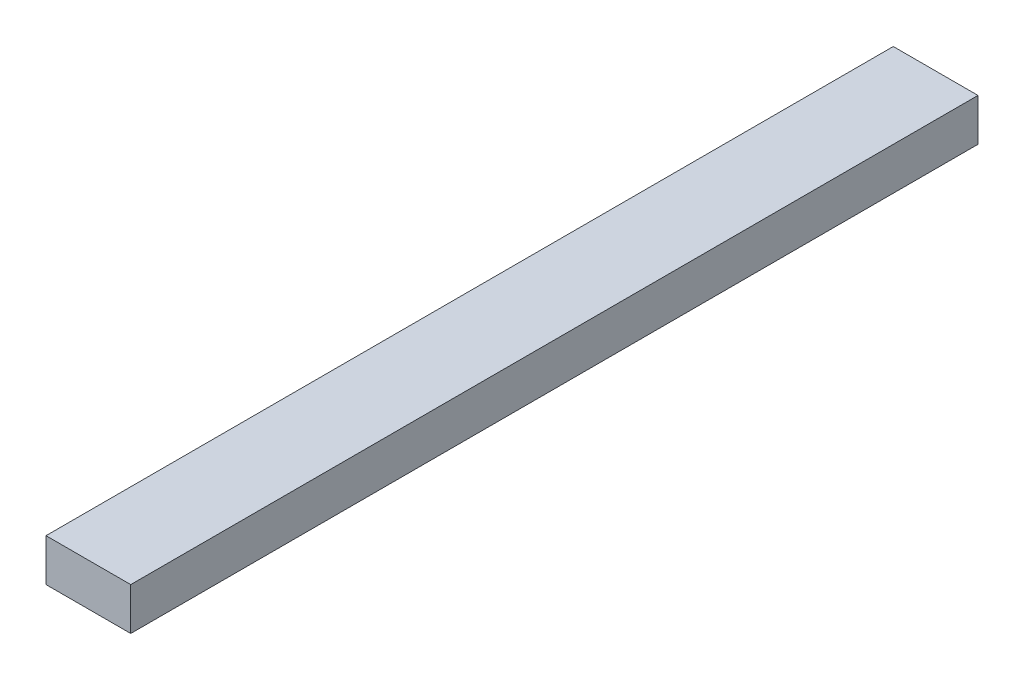
ISO-10303-21;
HEADER;
FILE_DESCRIPTION(('STEP AP214'),'2;1');
FILE_NAME('part.step','',(''),(''),'','','');
FILE_SCHEMA(('AUTOMOTIVE_DESIGN { 1 0 10303 214 1 1 1 1 }'));
ENDSEC;
DATA;
#1=APPLICATION_CONTEXT('core data for automotive mechanical design processes');
#2=APPLICATION_PROTOCOL_DEFINITION('international standard','automotive_design',2000,#1);
#3=PRODUCT_CONTEXT('',#1,'mechanical');
#4=PRODUCT('Part','Part','',(#3));
#5=PRODUCT_RELATED_PRODUCT_CATEGORY('part','',(#4));
#6=PRODUCT_DEFINITION_FORMATION('','',#4);
#7=PRODUCT_DEFINITION_CONTEXT('part definition',#1,'design');
#8=PRODUCT_DEFINITION('design','',#6,#7);
#9=PRODUCT_DEFINITION_SHAPE('','',#8);
#10=(LENGTH_UNIT() NAMED_UNIT(*) SI_UNIT(.MILLI.,.METRE.));
#11=(NAMED_UNIT(*) PLANE_ANGLE_UNIT() SI_UNIT($,.RADIAN.));
#12=(NAMED_UNIT(*) SI_UNIT($,.STERADIAN.) SOLID_ANGLE_UNIT());
#13=UNCERTAINTY_MEASURE_WITH_UNIT(LENGTH_MEASURE(1.E-05),#10,'distance_accuracy_value','');
#14=(GEOMETRIC_REPRESENTATION_CONTEXT(3) GLOBAL_UNCERTAINTY_ASSIGNED_CONTEXT((#13)) GLOBAL_UNIT_ASSIGNED_CONTEXT((#10,
#11,#12)) REPRESENTATION_CONTEXT('',''));
#15=CARTESIAN_POINT('',(0.,0.,0.));
#16=DIRECTION('',(0.,0.,1.));
#17=DIRECTION('',(1.,0.,0.));
#18=AXIS2_PLACEMENT_3D('',#15,#16,#17);
#19=CARTESIAN_POINT('',(0.,0.,1016.));
#20=DIRECTION('',(1.,0.,0.));
#21=DIRECTION('',(0.,0.,-1.));
#22=AXIS2_PLACEMENT_3D('',#19,#20,#21);
#23=PLANE('',#22);
#24=DIRECTION('',(0.,-1.,0.));
#25=VECTOR('',#24,1.);
#26=CARTESIAN_POINT('',(0.,0.,0.));
#27=LINE('',#26,#25);
#28=CARTESIAN_POINT('',(0.,50.8,0.));
#29=VERTEX_POINT('',#28);
#30=CARTESIAN_POINT('',(0.,0.,0.));
#31=VERTEX_POINT('',#30);
#32=EDGE_CURVE('E107',#29,#31,#27,.T.);
#33=ORIENTED_EDGE('',*,*,#32,.T.);
#34=DIRECTION('',(0.,0.,-1.));
#35=VECTOR('',#34,1.);
#36=CARTESIAN_POINT('',(0.,0.,1016.));
#37=LINE('',#36,#35);
#38=CARTESIAN_POINT('',(0.,0.,1016.));
#39=VERTEX_POINT('',#38);
#40=EDGE_CURVE('E11',#39,#31,#37,.T.);
#41=ORIENTED_EDGE('',*,*,#40,.F.);
#42=DIRECTION('',(0.,-1.,0.));
#43=VECTOR('',#42,1.);
#44=CARTESIAN_POINT('',(0.,0.,1016.));
#45=LINE('',#44,#43);
#46=CARTESIAN_POINT('',(0.,50.8,1016.));
#47=VERTEX_POINT('',#46);
#48=EDGE_CURVE('E91',#47,#39,#45,.T.);
#49=ORIENTED_EDGE('',*,*,#48,.F.);
#50=DIRECTION('',(0.,0.,-1.));
#51=VECTOR('',#50,1.);
#52=CARTESIAN_POINT('',(0.,50.8,1016.));
#53=LINE('',#52,#51);
#54=EDGE_CURVE('E103',#47,#29,#53,.T.);
#55=ORIENTED_EDGE('',*,*,#54,.T.);
#56=EDGE_LOOP('',(#33,#41,#49,#55));
#57=FACE_BOUND('',#56,.T.);
#58=ADVANCED_FACE('F39',(#57),#23,.F.);
#59=CARTESIAN_POINT('',(0.,0.,1016.));
#60=DIRECTION('',(0.,1.,0.));
#61=DIRECTION('',(0.,0.,1.));
#62=AXIS2_PLACEMENT_3D('',#59,#60,#61);
#63=PLANE('',#62);
#64=DIRECTION('',(1.,0.,0.));
#65=VECTOR('',#64,1.);
#66=CARTESIAN_POINT('',(0.,0.,0.));
#67=LINE('',#66,#65);
#68=CARTESIAN_POINT('',(101.6,0.,0.));
#69=VERTEX_POINT('',#68);
#70=EDGE_CURVE('E96',#31,#69,#67,.T.);
#71=ORIENTED_EDGE('',*,*,#70,.T.);
#72=DIRECTION('',(0.,0.,-1.));
#73=VECTOR('',#72,1.);
#74=CARTESIAN_POINT('',(101.6,0.,1016.));
#75=LINE('',#74,#73);
#76=CARTESIAN_POINT('',(101.6,0.,1016.));
#77=VERTEX_POINT('',#76);
#78=EDGE_CURVE('E48',#77,#69,#75,.T.);
#79=ORIENTED_EDGE('',*,*,#78,.F.);
#80=DIRECTION('',(1.,0.,0.));
#81=VECTOR('',#80,1.);
#82=CARTESIAN_POINT('',(0.,0.,1016.));
#83=LINE('',#82,#81);
#84=EDGE_CURVE('E86',#39,#77,#83,.T.);
#85=ORIENTED_EDGE('',*,*,#84,.F.);
#86=ORIENTED_EDGE('',*,*,#40,.T.);
#87=EDGE_LOOP('',(#71,#79,#85,#86));
#88=FACE_BOUND('',#87,.T.);
#89=ADVANCED_FACE('F95',(#88),#63,.F.);
#90=CARTESIAN_POINT('',(101.6,0.,1016.));
#91=DIRECTION('',(-1.,0.,0.));
#92=DIRECTION('',(0.,0.,1.));
#93=AXIS2_PLACEMENT_3D('',#90,#91,#92);
#94=PLANE('',#93);
#95=DIRECTION('',(0.,1.,0.));
#96=VECTOR('',#95,1.);
#97=CARTESIAN_POINT('',(101.6,0.,0.));
#98=LINE('',#97,#96);
#99=CARTESIAN_POINT('',(101.6,50.8,0.));
#100=VERTEX_POINT('',#99);
#101=EDGE_CURVE('E73',#69,#100,#98,.T.);
#102=ORIENTED_EDGE('',*,*,#101,.T.);
#103=DIRECTION('',(0.,0.,-1.));
#104=VECTOR('',#103,1.);
#105=CARTESIAN_POINT('',(101.6,50.8,1016.));
#106=LINE('',#105,#104);
#107=CARTESIAN_POINT('',(101.6,50.8,1016.));
#108=VERTEX_POINT('',#107);
#109=EDGE_CURVE('E98',#108,#100,#106,.T.);
#110=ORIENTED_EDGE('',*,*,#109,.F.);
#111=DIRECTION('',(0.,1.,0.));
#112=VECTOR('',#111,1.);
#113=CARTESIAN_POINT('',(101.6,0.,1016.));
#114=LINE('',#113,#112);
#115=EDGE_CURVE('E89',#77,#108,#114,.T.);
#116=ORIENTED_EDGE('',*,*,#115,.F.);
#117=ORIENTED_EDGE('',*,*,#78,.T.);
#118=EDGE_LOOP('',(#102,#110,#116,#117));
#119=FACE_BOUND('',#118,.T.);
#120=ADVANCED_FACE('F99',(#119),#94,.F.);
#121=CARTESIAN_POINT('',(0.,50.8,1016.));
#122=DIRECTION('',(0.,-1.,0.));
#123=DIRECTION('',(0.,0.,-1.));
#124=AXIS2_PLACEMENT_3D('',#121,#122,#123);
#125=PLANE('',#124);
#126=DIRECTION('',(-1.,0.,0.));
#127=VECTOR('',#126,1.);
#128=CARTESIAN_POINT('',(0.,50.8,0.));
#129=LINE('',#128,#127);
#130=EDGE_CURVE('E79',#100,#29,#129,.T.);
#131=ORIENTED_EDGE('',*,*,#130,.T.);
#132=ORIENTED_EDGE('',*,*,#54,.F.);
#133=DIRECTION('',(-1.,0.,0.));
#134=VECTOR('',#133,1.);
#135=CARTESIAN_POINT('',(0.,50.8,1016.));
#136=LINE('',#135,#134);
#137=EDGE_CURVE('E56',#108,#47,#136,.T.);
#138=ORIENTED_EDGE('',*,*,#137,.F.);
#139=ORIENTED_EDGE('',*,*,#109,.T.);
#140=EDGE_LOOP('',(#131,#132,#138,#139));
#141=FACE_BOUND('',#140,.T.);
#142=ADVANCED_FACE('F120',(#141),#125,.F.);
#143=CARTESIAN_POINT('',(0.,0.,1016.));
#144=DIRECTION('',(0.,0.,-1.));
#145=DIRECTION('',(-1.,0.,0.));
#146=AXIS2_PLACEMENT_3D('',#143,#144,#145);
#147=PLANE('',#146);
#148=ORIENTED_EDGE('',*,*,#48,.T.);
#149=ORIENTED_EDGE('',*,*,#84,.T.);
#150=ORIENTED_EDGE('',*,*,#115,.T.);
#151=ORIENTED_EDGE('',*,*,#137,.T.);
#152=EDGE_LOOP('',(#148,#149,#150,#151));
#153=FACE_BOUND('',#152,.T.);
#154=ADVANCED_FACE('F87',(#153),#147,.F.);
#155=CARTESIAN_POINT('',(0.,0.,0.));
#156=DIRECTION('',(0.,0.,-1.));
#157=DIRECTION('',(-1.,0.,0.));
#158=AXIS2_PLACEMENT_3D('',#155,#156,#157);
#159=PLANE('',#158);
#160=ORIENTED_EDGE('',*,*,#32,.F.);
#161=ORIENTED_EDGE('',*,*,#130,.F.);
#162=ORIENTED_EDGE('',*,*,#101,.F.);
#163=ORIENTED_EDGE('',*,*,#70,.F.);
#164=EDGE_LOOP('',(#160,#161,#162,#163));
#165=FACE_BOUND('',#164,.T.);
#166=ADVANCED_FACE('F123',(#165),#159,.T.);
#167=CLOSED_SHELL('',(#58,#89,#120,#142,#154,#166));
#168=MANIFOLD_SOLID_BREP('B2',#167);
#169=ADVANCED_BREP_SHAPE_REPRESENTATION('',(#18,#168),#14);
#170=SHAPE_DEFINITION_REPRESENTATION(#9,#169);
ENDSEC;
END-ISO-10303-21;
